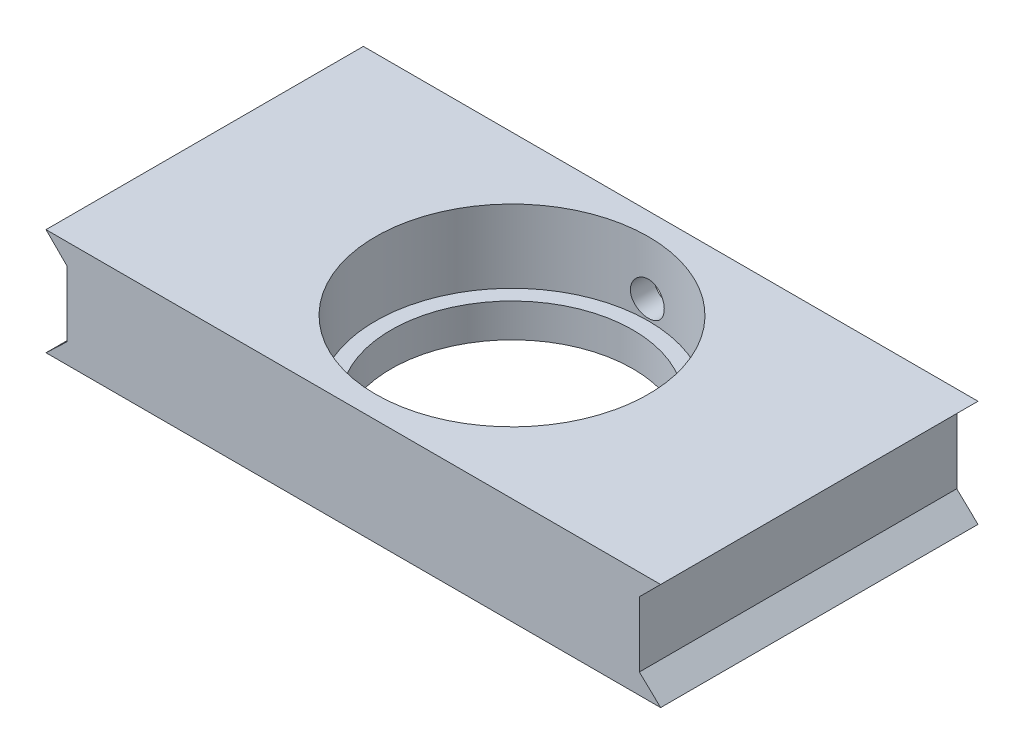
ISO-10303-21;
HEADER;
FILE_DESCRIPTION(('STEP AP214'),'2;1');
FILE_NAME('part.step','',(''),(''),'','','');
FILE_SCHEMA(('AUTOMOTIVE_DESIGN { 1 0 10303 214 1 1 1 1 }'));
ENDSEC;
DATA;
#1=APPLICATION_CONTEXT('core data for automotive mechanical design processes');
#2=APPLICATION_PROTOCOL_DEFINITION('international standard','automotive_design',2000,#1);
#3=PRODUCT_CONTEXT('',#1,'mechanical');
#4=PRODUCT('Part','Part','',(#3));
#5=PRODUCT_RELATED_PRODUCT_CATEGORY('part','',(#4));
#6=PRODUCT_DEFINITION_FORMATION('','',#4);
#7=PRODUCT_DEFINITION_CONTEXT('part definition',#1,'design');
#8=PRODUCT_DEFINITION('design','',#6,#7);
#9=PRODUCT_DEFINITION_SHAPE('','',#8);
#10=(LENGTH_UNIT() NAMED_UNIT(*) SI_UNIT(.MILLI.,.METRE.));
#11=(NAMED_UNIT(*) PLANE_ANGLE_UNIT() SI_UNIT($,.RADIAN.));
#12=(NAMED_UNIT(*) SI_UNIT($,.STERADIAN.) SOLID_ANGLE_UNIT());
#13=UNCERTAINTY_MEASURE_WITH_UNIT(LENGTH_MEASURE(1.E-05),#10,'distance_accuracy_value','');
#14=(GEOMETRIC_REPRESENTATION_CONTEXT(3) GLOBAL_UNCERTAINTY_ASSIGNED_CONTEXT((#13)) GLOBAL_UNIT_ASSIGNED_CONTEXT((#10,
#11,#12)) REPRESENTATION_CONTEXT('',''));
#15=CARTESIAN_POINT('',(0.,0.,0.));
#16=DIRECTION('',(0.,0.,1.));
#17=DIRECTION('',(1.,0.,0.));
#18=AXIS2_PLACEMENT_3D('',#15,#16,#17);
#19=CARTESIAN_POINT('',(2.56498973305955,-2.56398357289528,15.));
#20=DIRECTION('',(0.,1.,0.));
#21=DIRECTION('',(0.,0.,1.));
#22=AXIS2_PLACEMENT_3D('',#19,#20,#21);
#23=CYLINDRICAL_SURFACE('',#22,11.43);
#24=CARTESIAN_POINT('',(2.56498973305955,-2.56398357289528,15.));
#25=DIRECTION('',(0.,1.,0.));
#26=DIRECTION('',(0.,0.,1.));
#27=AXIS2_PLACEMENT_3D('',#24,#25,#26);
#28=CIRCLE('',#27,11.43);
#29=CARTESIAN_POINT('',(2.56498973305955,-2.56398357289528,26.43));
#30=VERTEX_POINT('',#29);
#31=EDGE_CURVE('E148',#30,#30,#28,.T.);
#32=ORIENTED_EDGE('',*,*,#31,.F.);
#33=EDGE_LOOP('',(#32));
#34=FACE_BOUND('',#33,.T.);
#35=CARTESIAN_POINT('',(2.56498973305955,0.616016427104725,15.));
#36=DIRECTION('',(0.,1.,0.));
#37=DIRECTION('',(0.,0.,1.));
#38=AXIS2_PLACEMENT_3D('',#35,#36,#37);
#39=CIRCLE('',#38,11.43);
#40=CARTESIAN_POINT('',(2.56498973305955,0.616016427104725,26.43));
#41=VERTEX_POINT('',#40);
#42=EDGE_CURVE('E222',#41,#41,#39,.T.);
#43=ORIENTED_EDGE('',*,*,#42,.T.);
#44=EDGE_LOOP('',(#43));
#45=FACE_BOUND('',#44,.T.);
#46=ADVANCED_FACE('F38',(#34,#45),#23,.F.);
#47=CARTESIAN_POINT('',(13.7503204414616,14.4434153714205,30.));
#48=DIRECTION('',(0.689515447591772,0.724270976591164,0.));
#49=DIRECTION('',(-0.724270976591164,0.689515447591772,0.));
#50=AXIS2_PLACEMENT_3D('',#47,#48,#49);
#51=PLANE('',#50);
#52=DIRECTION('',(0.724270976591164,-0.689515447591772,0.));
#53=VECTOR('',#52,1.);
#54=CARTESIAN_POINT('',(13.7503204414616,14.4434153714205,0.));
#55=LINE('',#54,#53);
#56=CARTESIAN_POINT('',(29.6068064744898,-0.652166831465045,0.));
#57=VERTEX_POINT('',#56);
#58=CARTESIAN_POINT('',(31.6149897330595,-2.56398357289528,0.));
#59=VERTEX_POINT('',#58);
#60=EDGE_CURVE('E143',#57,#59,#55,.T.);
#61=ORIENTED_EDGE('',*,*,#60,.F.);
#62=DIRECTION('',(0.,0.,-1.));
#63=VECTOR('',#62,1.);
#64=CARTESIAN_POINT('',(29.6068064744898,-0.652166831465045,30.));
#65=LINE('',#64,#63);
#66=CARTESIAN_POINT('',(29.6068064744898,-0.652166831465045,30.));
#67=VERTEX_POINT('',#66);
#68=EDGE_CURVE('E11',#67,#57,#65,.T.);
#69=ORIENTED_EDGE('',*,*,#68,.F.);
#70=DIRECTION('',(0.724270976591164,-0.689515447591772,0.));
#71=VECTOR('',#70,1.);
#72=CARTESIAN_POINT('',(13.7503204414616,14.4434153714205,30.));
#73=LINE('',#72,#71);
#74=CARTESIAN_POINT('',(31.6149897330595,-2.56398357289528,30.));
#75=VERTEX_POINT('',#74);
#76=EDGE_CURVE('E170',#67,#75,#73,.T.);
#77=ORIENTED_EDGE('',*,*,#76,.T.);
#78=DIRECTION('',(0.,0.,-1.));
#79=VECTOR('',#78,1.);
#80=CARTESIAN_POINT('',(31.6149897330595,-2.56398357289528,30.));
#81=LINE('',#80,#79);
#82=EDGE_CURVE('E97',#75,#59,#81,.T.);
#83=ORIENTED_EDGE('',*,*,#82,.T.);
#84=EDGE_LOOP('',(#61,#69,#77,#83));
#85=FACE_BOUND('',#84,.T.);
#86=ADVANCED_FACE('F40',(#85),#51,.T.);
#87=CARTESIAN_POINT('',(29.6068064744898,0.,30.));
#88=DIRECTION('',(1.,0.,0.));
#89=DIRECTION('',(0.,0.,-1.));
#90=AXIS2_PLACEMENT_3D('',#87,#88,#89);
#91=PLANE('',#90);
#92=DIRECTION('',(0.,-1.,0.));
#93=VECTOR('',#92,1.);
#94=CARTESIAN_POINT('',(29.6068064744898,0.,0.));
#95=LINE('',#94,#93);
#96=CARTESIAN_POINT('',(29.6068064744898,5.50783316853495,0.));
#97=VERTEX_POINT('',#96);
#98=EDGE_CURVE('E147',#97,#57,#95,.T.);
#99=ORIENTED_EDGE('',*,*,#98,.F.);
#100=DIRECTION('',(0.,0.,-1.));
#101=VECTOR('',#100,1.);
#102=CARTESIAN_POINT('',(29.6068064744898,5.50783316853495,30.));
#103=LINE('',#102,#101);
#104=CARTESIAN_POINT('',(29.6068064744898,5.50783316853495,30.));
#105=VERTEX_POINT('',#104);
#106=EDGE_CURVE('E54',#105,#97,#103,.T.);
#107=ORIENTED_EDGE('',*,*,#106,.F.);
#108=DIRECTION('',(0.,-1.,0.));
#109=VECTOR('',#108,1.);
#110=CARTESIAN_POINT('',(29.6068064744898,0.,30.));
#111=LINE('',#110,#109);
#112=EDGE_CURVE('E203',#105,#67,#111,.T.);
#113=ORIENTED_EDGE('',*,*,#112,.T.);
#114=ORIENTED_EDGE('',*,*,#68,.T.);
#115=EDGE_LOOP('',(#99,#107,#113,#114));
#116=FACE_BOUND('',#115,.T.);
#117=ADVANCED_FACE('F194',(#116),#91,.T.);
#118=CARTESIAN_POINT('',(12.0494866529777,-12.0494866529775,30.));
#119=DIRECTION('',(0.707106781186554,-0.707106781186541,0.));
#120=DIRECTION('',(0.707106781186541,0.707106781186554,0.));
#121=AXIS2_PLACEMENT_3D('',#118,#119,#120);
#122=PLANE('',#121);
#123=DIRECTION('',(-0.707106781186541,-0.707106781186554,0.));
#124=VECTOR('',#123,1.);
#125=CARTESIAN_POINT('',(12.0494866529777,-12.0494866529775,0.));
#126=LINE('',#125,#124);
#127=CARTESIAN_POINT('',(31.6149897330595,7.51601642710473,0.));
#128=VERTEX_POINT('',#127);
#129=EDGE_CURVE('E152',#128,#97,#126,.T.);
#130=ORIENTED_EDGE('',*,*,#129,.F.);
#131=DIRECTION('',(0.,0.,-1.));
#132=VECTOR('',#131,1.);
#133=CARTESIAN_POINT('',(31.6149897330595,7.51601642710473,30.));
#134=LINE('',#133,#132);
#135=CARTESIAN_POINT('',(31.6149897330595,7.51601642710473,30.));
#136=VERTEX_POINT('',#135);
#137=EDGE_CURVE('E180',#136,#128,#134,.T.);
#138=ORIENTED_EDGE('',*,*,#137,.F.);
#139=DIRECTION('',(-0.707106781186541,-0.707106781186554,0.));
#140=VECTOR('',#139,1.);
#141=CARTESIAN_POINT('',(12.0494866529777,-12.0494866529775,30.));
#142=LINE('',#141,#140);
#143=EDGE_CURVE('E190',#136,#105,#142,.T.);
#144=ORIENTED_EDGE('',*,*,#143,.T.);
#145=ORIENTED_EDGE('',*,*,#106,.T.);
#146=EDGE_LOOP('',(#130,#138,#144,#145));
#147=FACE_BOUND('',#146,.T.);
#148=ADVANCED_FACE('F188',(#147),#122,.T.);
#149=CARTESIAN_POINT('',(0.,7.51601642710473,30.));
#150=DIRECTION('',(0.,1.,0.));
#151=DIRECTION('',(0.,0.,1.));
#152=AXIS2_PLACEMENT_3D('',#149,#150,#151);
#153=PLANE('',#152);
#154=CARTESIAN_POINT('',(2.56498973305955,7.51601642710473,15.));
#155=DIRECTION('',(0.,1.,0.));
#156=DIRECTION('',(0.,0.,1.));
#157=AXIS2_PLACEMENT_3D('',#154,#155,#156);
#158=CIRCLE('',#157,12.9);
#159=CARTESIAN_POINT('',(2.56498973305955,7.51601642710473,27.9));
#160=VERTEX_POINT('',#159);
#161=EDGE_CURVE('E218',#160,#160,#158,.T.);
#162=ORIENTED_EDGE('',*,*,#161,.F.);
#163=EDGE_LOOP('',(#162));
#164=FACE_BOUND('',#163,.T.);
#165=DIRECTION('',(1.,0.,0.));
#166=VECTOR('',#165,1.);
#167=CARTESIAN_POINT('',(0.,7.51601642710473,0.));
#168=LINE('',#167,#166);
#169=CARTESIAN_POINT('',(-26.4850102669404,7.51601642710472,0.));
#170=VERTEX_POINT('',#169);
#171=EDGE_CURVE('E156',#170,#128,#168,.T.);
#172=ORIENTED_EDGE('',*,*,#171,.F.);
#173=DIRECTION('',(0.,0.,-1.));
#174=VECTOR('',#173,1.);
#175=CARTESIAN_POINT('',(-26.4850102669404,7.51601642710472,30.));
#176=LINE('',#175,#174);
#177=CARTESIAN_POINT('',(-26.4850102669404,7.51601642710472,30.));
#178=VERTEX_POINT('',#177);
#179=EDGE_CURVE('E177',#178,#170,#176,.T.);
#180=ORIENTED_EDGE('',*,*,#179,.F.);
#181=DIRECTION('',(1.,0.,0.));
#182=VECTOR('',#181,1.);
#183=CARTESIAN_POINT('',(0.,7.51601642710473,30.));
#184=LINE('',#183,#182);
#185=EDGE_CURVE('E202',#178,#136,#184,.T.);
#186=ORIENTED_EDGE('',*,*,#185,.T.);
#187=ORIENTED_EDGE('',*,*,#137,.T.);
#188=EDGE_LOOP('',(#172,#180,#186,#187));
#189=FACE_BOUND('',#188,.T.);
#190=ADVANCED_FACE('F200',(#164,#189),#153,.T.);
#191=CARTESIAN_POINT('',(-9.48449691991754,-9.48449691991777,30.));
#192=DIRECTION('',(0.707106781186539,0.707106781186556,0.));
#193=DIRECTION('',(-0.707106781186556,0.707106781186539,0.));
#194=AXIS2_PLACEMENT_3D('',#191,#192,#193);
#195=PLANE('',#194);
#196=DIRECTION('',(0.707106781186556,-0.707106781186539,0.));
#197=VECTOR('',#196,1.);
#198=CARTESIAN_POINT('',(-9.48449691991754,-9.48449691991777,0.));
#199=LINE('',#198,#197);
#200=CARTESIAN_POINT('',(-24.4768270083706,5.50783316853496,0.));
#201=VERTEX_POINT('',#200);
#202=EDGE_CURVE('E160',#170,#201,#199,.T.);
#203=ORIENTED_EDGE('',*,*,#202,.T.);
#204=DIRECTION('',(0.,0.,-1.));
#205=VECTOR('',#204,1.);
#206=CARTESIAN_POINT('',(-24.4768270083706,5.50783316853496,30.));
#207=LINE('',#206,#205);
#208=CARTESIAN_POINT('',(-24.4768270083706,5.50783316853496,30.));
#209=VERTEX_POINT('',#208);
#210=EDGE_CURVE('E133',#209,#201,#207,.T.);
#211=ORIENTED_EDGE('',*,*,#210,.F.);
#212=DIRECTION('',(0.707106781186556,-0.707106781186539,0.));
#213=VECTOR('',#212,1.);
#214=CARTESIAN_POINT('',(-9.48449691991754,-9.48449691991777,30.));
#215=LINE('',#214,#213);
#216=EDGE_CURVE('E122',#178,#209,#215,.T.);
#217=ORIENTED_EDGE('',*,*,#216,.F.);
#218=ORIENTED_EDGE('',*,*,#179,.T.);
#219=EDGE_LOOP('',(#203,#211,#217,#218));
#220=FACE_BOUND('',#219,.T.);
#221=ADVANCED_FACE('F275',(#220),#195,.F.);
#222=CARTESIAN_POINT('',(-24.4768270083706,0.,30.));
#223=DIRECTION('',(1.,0.,0.));
#224=DIRECTION('',(0.,1.,0.));
#225=AXIS2_PLACEMENT_3D('',#222,#223,#224);
#226=PLANE('',#225);
#227=DIRECTION('',(0.,-1.,0.));
#228=VECTOR('',#227,1.);
#229=CARTESIAN_POINT('',(-24.4768270083706,0.,0.));
#230=LINE('',#229,#228);
#231=CARTESIAN_POINT('',(-24.4768270083706,-0.652166831465045,0.));
#232=VERTEX_POINT('',#231);
#233=EDGE_CURVE('E131',#201,#232,#230,.T.);
#234=ORIENTED_EDGE('',*,*,#233,.T.);
#235=DIRECTION('',(0.,0.,-1.));
#236=VECTOR('',#235,1.);
#237=CARTESIAN_POINT('',(-24.4768270083706,-0.652166831465045,30.));
#238=LINE('',#237,#236);
#239=CARTESIAN_POINT('',(-24.4768270083706,-0.652166831465045,30.));
#240=VERTEX_POINT('',#239);
#241=EDGE_CURVE('E128',#240,#232,#238,.T.);
#242=ORIENTED_EDGE('',*,*,#241,.F.);
#243=DIRECTION('',(0.,-1.,0.));
#244=VECTOR('',#243,1.);
#245=CARTESIAN_POINT('',(-24.4768270083706,0.,30.));
#246=LINE('',#245,#244);
#247=EDGE_CURVE('E115',#209,#240,#246,.T.);
#248=ORIENTED_EDGE('',*,*,#247,.F.);
#249=ORIENTED_EDGE('',*,*,#210,.T.);
#250=EDGE_LOOP('',(#234,#242,#248,#249));
#251=FACE_BOUND('',#250,.T.);
#252=ADVANCED_FACE('F129',(#251),#226,.F.);
#253=CARTESIAN_POINT('',(-11.3113663397567,11.8815240094907,30.));
#254=DIRECTION('',(0.689515447591754,-0.724270976591181,0.));
#255=DIRECTION('',(0.724270976591181,0.689515447591755,0.));
#256=AXIS2_PLACEMENT_3D('',#253,#254,#255);
#257=PLANE('',#256);
#258=DIRECTION('',(-0.724270976591181,-0.689515447591755,0.));
#259=VECTOR('',#258,1.);
#260=CARTESIAN_POINT('',(-11.3113663397567,11.8815240094907,0.));
#261=LINE('',#260,#259);
#262=CARTESIAN_POINT('',(-26.4850102669405,-2.56398357289528,0.));
#263=VERTEX_POINT('',#262);
#264=EDGE_CURVE('E90',#232,#263,#261,.T.);
#265=ORIENTED_EDGE('',*,*,#264,.T.);
#266=DIRECTION('',(0.,0.,-1.));
#267=VECTOR('',#266,1.);
#268=CARTESIAN_POINT('',(-26.4850102669405,-2.56398357289528,30.));
#269=LINE('',#268,#267);
#270=CARTESIAN_POINT('',(-26.4850102669405,-2.56398357289528,30.));
#271=VERTEX_POINT('',#270);
#272=EDGE_CURVE('E134',#271,#263,#269,.T.);
#273=ORIENTED_EDGE('',*,*,#272,.F.);
#274=DIRECTION('',(-0.724270976591181,-0.689515447591755,0.));
#275=VECTOR('',#274,1.);
#276=CARTESIAN_POINT('',(-11.3113663397567,11.8815240094907,30.));
#277=LINE('',#276,#275);
#278=EDGE_CURVE('E119',#240,#271,#277,.T.);
#279=ORIENTED_EDGE('',*,*,#278,.F.);
#280=ORIENTED_EDGE('',*,*,#241,.T.);
#281=EDGE_LOOP('',(#265,#273,#279,#280));
#282=FACE_BOUND('',#281,.T.);
#283=ADVANCED_FACE('F136',(#282),#257,.F.);
#284=CARTESIAN_POINT('',(0.,-2.56398357289528,30.));
#285=DIRECTION('',(0.,1.,0.));
#286=DIRECTION('',(0.,0.,1.));
#287=AXIS2_PLACEMENT_3D('',#284,#285,#286);
#288=PLANE('',#287);
#289=ORIENTED_EDGE('',*,*,#31,.T.);
#290=EDGE_LOOP('',(#289));
#291=FACE_BOUND('',#290,.T.);
#292=DIRECTION('',(1.,0.,0.));
#293=VECTOR('',#292,1.);
#294=CARTESIAN_POINT('',(0.,-2.56398357289528,0.));
#295=LINE('',#294,#293);
#296=EDGE_CURVE('E167',#263,#59,#295,.T.);
#297=ORIENTED_EDGE('',*,*,#296,.T.);
#298=ORIENTED_EDGE('',*,*,#82,.F.);
#299=DIRECTION('',(1.,0.,0.));
#300=VECTOR('',#299,1.);
#301=CARTESIAN_POINT('',(0.,-2.56398357289528,30.));
#302=LINE('',#301,#300);
#303=EDGE_CURVE('E62',#271,#75,#302,.T.);
#304=ORIENTED_EDGE('',*,*,#303,.F.);
#305=ORIENTED_EDGE('',*,*,#272,.T.);
#306=EDGE_LOOP('',(#297,#298,#304,#305));
#307=FACE_BOUND('',#306,.T.);
#308=ADVANCED_FACE('F264',(#291,#307),#288,.F.);
#309=CARTESIAN_POINT('',(0.,0.,30.));
#310=DIRECTION('',(0.,0.,1.));
#311=DIRECTION('',(1.,0.,0.));
#312=AXIS2_PLACEMENT_3D('',#309,#310,#311);
#313=PLANE('',#312);
#314=ORIENTED_EDGE('',*,*,#76,.F.);
#315=ORIENTED_EDGE('',*,*,#112,.F.);
#316=ORIENTED_EDGE('',*,*,#143,.F.);
#317=ORIENTED_EDGE('',*,*,#185,.F.);
#318=ORIENTED_EDGE('',*,*,#216,.T.);
#319=ORIENTED_EDGE('',*,*,#247,.T.);
#320=ORIENTED_EDGE('',*,*,#278,.T.);
#321=ORIENTED_EDGE('',*,*,#303,.T.);
#322=EDGE_LOOP('',(#314,#315,#316,#317,#318,#319,#320,#321));
#323=FACE_BOUND('',#322,.T.);
#324=ADVANCED_FACE('F117',(#323),#313,.T.);
#325=CARTESIAN_POINT('',(0.,0.,0.));
#326=DIRECTION('',(0.,0.,1.));
#327=DIRECTION('',(1.,0.,0.));
#328=AXIS2_PLACEMENT_3D('',#325,#326,#327);
#329=PLANE('',#328);
#330=CARTESIAN_POINT('',(2.55680647448981,2.42783316853495,0.));
#331=DIRECTION('',(0.,0.,-1.));
#332=DIRECTION('',(-1.,0.,0.));
#333=AXIS2_PLACEMENT_3D('',#330,#331,#332);
#334=CIRCLE('',#333,1.6);
#335=CARTESIAN_POINT('',(0.956806474489814,2.42783316853495,0.));
#336=VERTEX_POINT('',#335);
#337=EDGE_CURVE('E229',#336,#336,#334,.T.);
#338=ORIENTED_EDGE('',*,*,#337,.F.);
#339=EDGE_LOOP('',(#338));
#340=FACE_BOUND('',#339,.T.);
#341=ORIENTED_EDGE('',*,*,#60,.T.);
#342=ORIENTED_EDGE('',*,*,#296,.F.);
#343=ORIENTED_EDGE('',*,*,#264,.F.);
#344=ORIENTED_EDGE('',*,*,#233,.F.);
#345=ORIENTED_EDGE('',*,*,#202,.F.);
#346=ORIENTED_EDGE('',*,*,#171,.T.);
#347=ORIENTED_EDGE('',*,*,#129,.T.);
#348=ORIENTED_EDGE('',*,*,#98,.T.);
#349=EDGE_LOOP('',(#341,#342,#343,#344,#345,#346,#347,#348));
#350=FACE_BOUND('',#349,.T.);
#351=ADVANCED_FACE('F196',(#340,#350),#329,.F.);
#352=CARTESIAN_POINT('',(2.56498973305955,0.616016427104725,15.));
#353=DIRECTION('',(0.,1.,0.));
#354=DIRECTION('',(0.,0.,1.));
#355=AXIS2_PLACEMENT_3D('',#352,#353,#354);
#356=CYLINDRICAL_SURFACE('',#355,12.9);
#357=CARTESIAN_POINT('',(0.956806474489814,2.42783316853495,2.20063491391639));
#358=CARTESIAN_POINT('',(0.956810283786553,2.51732967549705,2.20063363440097));
#359=CARTESIAN_POINT('',(0.964340844288109,2.60688225980452,2.19968128589643));
#360=CARTESIAN_POINT('',(0.994262787677201,2.78349543433983,2.19597581334614));
#361=CARTESIAN_POINT('',(1.01666973661449,2.87055331456965,2.19322080311191));
#362=CARTESIAN_POINT('',(1.07567373137931,3.03959428393578,2.18622558167352));
#363=CARTESIAN_POINT('',(1.11226115770174,3.1215807696898,2.18198637747904));
#364=CARTESIAN_POINT('',(1.19856685505663,3.27823471850723,2.17249968563286));
#365=CARTESIAN_POINT('',(1.24828286950474,3.35290343635106,2.1672523713006));
#366=CARTESIAN_POINT('',(1.3597306056377,3.49323306346811,2.15630536098679));
#367=CARTESIAN_POINT('',(1.42152079670183,3.5588473770273,2.15060354699935));
#368=CARTESIAN_POINT('',(1.55523693190255,3.67880337795975,2.13940547372748));
#369=CARTESIAN_POINT('',(1.62716338232852,3.73314450192046,2.13390922472805));
#370=CARTESIAN_POINT('',(1.77940592382764,3.82918067706417,2.12371603196277));
#371=CARTESIAN_POINT('',(1.85974910225578,3.87083310066724,2.11902180527695));
#372=CARTESIAN_POINT('',(2.02635798476662,3.94003701261102,2.11098049377705));
#373=CARTESIAN_POINT('',(2.11262347299419,3.96758901457185,2.10763335989489));
#374=CARTESIAN_POINT('',(2.2881574771751,4.00767196884181,2.10267354831755));
#375=CARTESIAN_POINT('',(2.37740825409202,4.02027949376839,2.10105203329642));
#376=CARTESIAN_POINT('',(2.55677271026749,4.03035228332462,2.09969094354669));
#377=CARTESIAN_POINT('',(2.64688635565746,4.02781813986953,2.09995129525259));
#378=CARTESIAN_POINT('',(2.82489106547173,4.00774103385829,2.10231286676303));
#379=CARTESIAN_POINT('',(2.91279168937834,3.99028144687288,2.10440386190588));
#380=CARTESIAN_POINT('',(3.08440616905167,3.94097876907779,2.11017521344813));
#381=CARTESIAN_POINT('',(3.16811994802532,3.90913541455544,2.11385559898745));
#382=CARTESIAN_POINT('',(3.32923376289513,3.83188385730748,2.12240461510792));
#383=CARTESIAN_POINT('',(3.40661694223526,3.786440849636,2.1272762885733));
#384=CARTESIAN_POINT('',(3.55269024313763,3.68330520806476,2.13765891454958));
#385=CARTESIAN_POINT('',(3.62137997365331,3.62561202344294,2.14316989579629));
#386=CARTESIAN_POINT('',(3.74859982354563,3.49915303342426,2.15425438073688));
#387=CARTESIAN_POINT('',(3.80705868869375,3.43031553711319,2.15982805583916));
#388=CARTESIAN_POINT('',(3.91160393211155,3.28376846219559,2.17037023998802));
#389=CARTESIAN_POINT('',(3.95769026947375,3.20605885425627,2.1753387470337));
#390=CARTESIAN_POINT('',(4.0361885047282,3.04390615143535,2.18410586192882));
#391=CARTESIAN_POINT('',(4.06859405889652,2.9594599543554,2.18790392682903));
#392=CARTESIAN_POINT('',(4.11874491332119,2.78626724251635,2.19388862486855));
#393=CARTESIAN_POINT('',(4.13649090157111,2.69752092977456,2.19607533363051));
#394=CARTESIAN_POINT('',(4.15672536158214,2.51887122023127,2.19857497247791));
#395=CARTESIAN_POINT('',(4.15931327577903,2.42897925102681,2.19890011479318));
#396=CARTESIAN_POINT('',(4.14942046582008,2.25004303552912,2.19767196485249));
#397=CARTESIAN_POINT('',(4.13694005464036,2.16099877166738,2.19611871161169));
#398=CARTESIAN_POINT('',(4.09734878366844,1.98658418297221,2.19132063236523));
#399=CARTESIAN_POINT('',(4.07028617887291,1.90120273769831,2.18808138679612));
#400=CARTESIAN_POINT('',(4.00234830380569,1.73618958948951,2.18028227325826));
#401=CARTESIAN_POINT('',(3.96147255821826,1.65655808452682,2.17572235984556));
#402=CARTESIAN_POINT('',(3.86682324477055,1.50485407624647,2.16576854632144));
#403=CARTESIAN_POINT('',(3.81298426042972,1.43282266541082,2.16037046727301));
#404=CARTESIAN_POINT('',(3.69402912507222,1.29878285555759,2.14936464988584));
#405=CARTESIAN_POINT('',(3.6289125473797,1.23677483593613,2.14375690362086));
#406=CARTESIAN_POINT('',(3.48881701158971,1.12419375327493,2.13292974810724));
#407=CARTESIAN_POINT('',(3.41378545996341,1.07368588264942,2.127712660113));
#408=CARTESIAN_POINT('',(3.25624582760741,0.985990119079924,2.11829269070217));
#409=CARTESIAN_POINT('',(3.17373789770774,0.948801957496245,2.11408978883144));
#410=CARTESIAN_POINT('',(3.00381095708064,0.888911356592487,2.10718645569036));
#411=CARTESIAN_POINT('',(2.91640576973005,0.866170178338938,2.10448200889414));
#412=CARTESIAN_POINT('',(2.7389823482743,0.835692159383838,2.10086843447591));
#413=CARTESIAN_POINT('',(2.64896422975446,0.82795465600506,2.09995922756231));
#414=CARTESIAN_POINT('',(2.46951180751657,0.827715320960254,2.10004333025186));
#415=CARTESIAN_POINT('',(2.38007761581986,0.835112180729412,2.10102398666341));
#416=CARTESIAN_POINT('',(2.2037346653314,0.864716509634007,2.10475764164713));
#417=CARTESIAN_POINT('',(2.11682590605162,0.886923975907327,2.1075106398768));
#418=CARTESIAN_POINT('',(1.9480068336029,0.945489134452254,2.11448589887275));
#419=CARTESIAN_POINT('',(1.86609519430015,0.981843053481171,2.11870776781958));
#420=CARTESIAN_POINT('',(1.70951940344374,1.06765845029569,2.12815747426116));
#421=CARTESIAN_POINT('',(1.63485533492943,1.11712007823921,2.1333853232799));
#422=CARTESIAN_POINT('',(1.49437018512899,1.22812659881232,2.14430949296789));
#423=CARTESIAN_POINT('',(1.42860962233818,1.28974780827012,2.15000863311223));
#424=CARTESIAN_POINT('',(1.30832257683144,1.4231659501138,2.16121317905781));
#425=CARTESIAN_POINT('',(1.25379875923083,1.49496528973425,2.1667185386423));
#426=CARTESIAN_POINT('',(1.15735768509721,1.64701234283459,2.17693718811343));
#427=CARTESIAN_POINT('',(1.11548880144035,1.72729092945085,2.18164740909091));
#428=CARTESIAN_POINT('',(1.04588621236157,1.89375352112382,2.18970870077554));
#429=CARTESIAN_POINT('',(1.01813709937144,1.97993097225998,2.1930612521596));
#430=CARTESIAN_POINT('',(0.984218700336006,2.12676935505659,2.19721353827097));
#431=CARTESIAN_POINT('',(0.973953873211514,2.18650319462871,2.19849020032436));
#432=CARTESIAN_POINT('',(0.960246497275095,2.30676052694081,2.20020131781907));
#433=CARTESIAN_POINT('',(0.956803897297634,2.36728401375515,2.20063577957673));
#434=CARTESIAN_POINT('',(0.956806474489814,2.42783316853495,2.20063491391639));
#435=B_SPLINE_CURVE_WITH_KNOTS('',3,(#357,#358,#359,#360,#361,#362,#363,#364,#365,#366,#367,
#368,#369,#370,#371,#372,#373,#374,#375,#376,#377,#378,#379,#380,#381,#382,#383,#384,#385,#386,
#387,#388,#389,#390,#391,#392,#393,#394,#395,#396,#397,#398,#399,#400,#401,#402,#403,#404,#405,
#406,#407,#408,#409,#410,#411,#412,#413,#414,#415,#416,#417,#418,#419,#420,#421,#422,#423,#424,
#425,#426,#427,#428,#429,#430,#431,#432,#433,#434),.UNSPECIFIED.,.T.,.F.,(4,2,2,2,2,2,2,2,2,2,2,
2,2,2,2,2,2,2,2,2,2,2,2,2,2,2,2,2,2,2,2,2,2,2,2,2,2,2,4),(0.,0.268268315882681,
0.536817780190358,0.805185388548042,1.0735068990008,1.34316148632722,1.61282954723128,
1.88339381104014,2.15394821860886,2.42311028142984,2.69226182228676,2.95991959774591,
3.22758228065464,3.49593592477007,3.76430163561528,4.03446785138838,4.30463496040506,
4.57492720758754,4.84520676886257,5.11371119505281,5.38221004437735,5.64982579288241,
5.91745075109124,6.18645562570256,6.45547068005388,6.725974738011,6.99647333997654,
7.26624351607198,7.53600177677828,7.80396019962638,8.07191857069214,8.33980551892742,
8.60769553612662,8.87732368584724,9.14701571217956,9.41772595248171,9.688140155422,
9.86963932400988,10.0511371313799),.UNSPECIFIED.);
#436=CARTESIAN_POINT('',(0.956806474489814,2.42783316853495,2.20063491391639));
#437=VERTEX_POINT('',#436);
#438=EDGE_CURVE('E42',#437,#437,#435,.T.);
#439=ORIENTED_EDGE('',*,*,#438,.T.);
#440=EDGE_LOOP('',(#439));
#441=FACE_BOUND('',#440,.T.);
#442=CARTESIAN_POINT('',(2.56498973305955,0.616016427104725,15.));
#443=DIRECTION('',(0.,1.,0.));
#444=DIRECTION('',(0.,0.,1.));
#445=AXIS2_PLACEMENT_3D('',#442,#443,#444);
#446=CIRCLE('',#445,12.9);
#447=CARTESIAN_POINT('',(2.56498973305955,0.616016427104725,27.9));
#448=VERTEX_POINT('',#447);
#449=EDGE_CURVE('E217',#448,#448,#446,.T.);
#450=ORIENTED_EDGE('',*,*,#449,.F.);
#451=EDGE_LOOP('',(#450));
#452=FACE_BOUND('',#451,.T.);
#453=ORIENTED_EDGE('',*,*,#161,.T.);
#454=EDGE_LOOP('',(#453));
#455=FACE_BOUND('',#454,.T.);
#456=ADVANCED_FACE('F238',(#441,#452,#455),#356,.F.);
#457=CARTESIAN_POINT('',(2.56498973305955,0.616016427104725,15.));
#458=DIRECTION('',(0.,1.,0.));
#459=DIRECTION('',(0.,0.,1.));
#460=AXIS2_PLACEMENT_3D('',#457,#458,#459);
#461=PLANE('',#460);
#462=ORIENTED_EDGE('',*,*,#42,.F.);
#463=EDGE_LOOP('',(#462));
#464=FACE_BOUND('',#463,.T.);
#465=ORIENTED_EDGE('',*,*,#449,.T.);
#466=EDGE_LOOP('',(#465));
#467=FACE_BOUND('',#466,.T.);
#468=ADVANCED_FACE('F243',(#464,#467),#461,.T.);
#469=CARTESIAN_POINT('',(2.55680647448981,2.42783316853495,5.));
#470=DIRECTION('',(0.,0.,-1.));
#471=DIRECTION('',(-1.,0.,0.));
#472=AXIS2_PLACEMENT_3D('',#469,#470,#471);
#473=CYLINDRICAL_SURFACE('',#472,1.6);
#474=ORIENTED_EDGE('',*,*,#337,.T.);
#475=EDGE_LOOP('',(#474));
#476=FACE_BOUND('',#475,.T.);
#477=ORIENTED_EDGE('',*,*,#438,.F.);
#478=EDGE_LOOP('',(#477));
#479=FACE_BOUND('',#478,.T.);
#480=ADVANCED_FACE('F241',(#476,#479),#473,.F.);
#481=CLOSED_SHELL('',(#46,#86,#117,#148,#190,#221,#252,#283,#308,#324,#351,#456,#468,#480));
#482=MANIFOLD_SOLID_BREP('B2',#481);
#483=ADVANCED_BREP_SHAPE_REPRESENTATION('',(#18,#482),#14);
#484=SHAPE_DEFINITION_REPRESENTATION(#9,#483);
ENDSEC;
END-ISO-10303-21;
